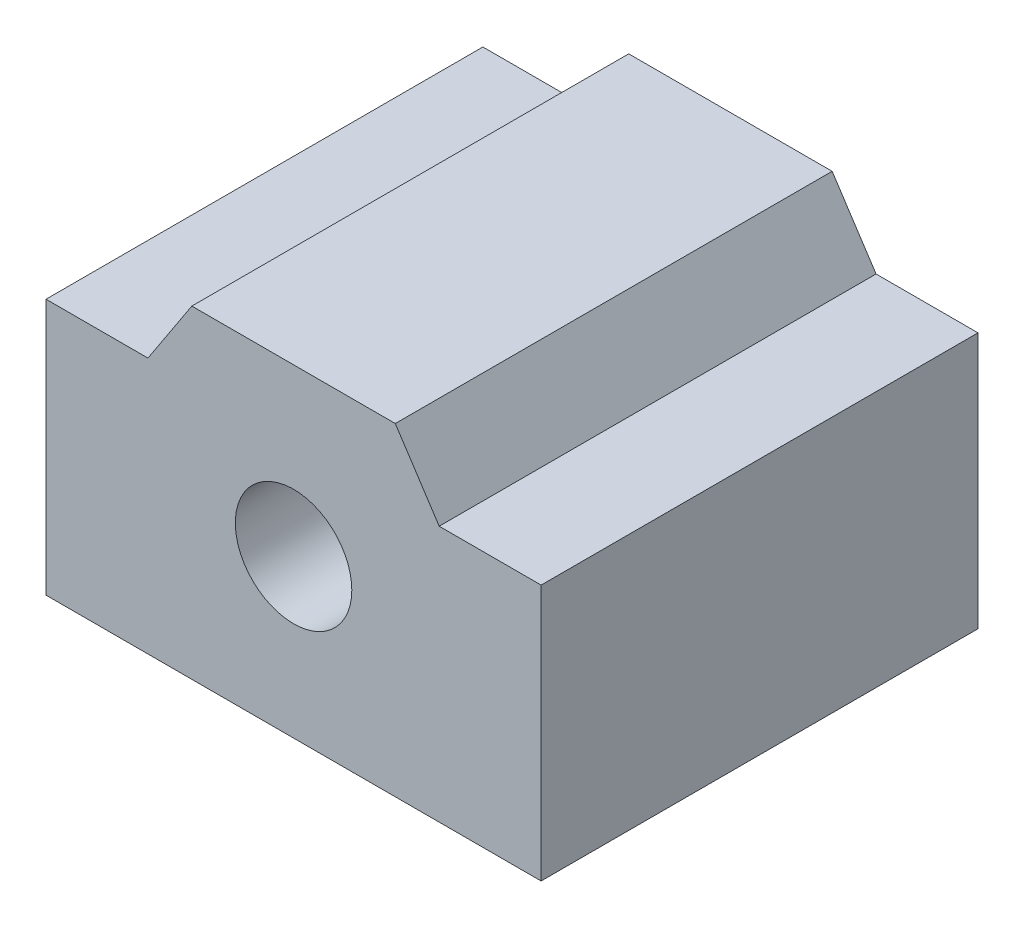
ISO-10303-21;
HEADER;
FILE_DESCRIPTION(('STEP AP214'),'2;1');
FILE_NAME('part.step','',(''),(''),'','','');
FILE_SCHEMA(('AUTOMOTIVE_DESIGN { 1 0 10303 214 1 1 1 1 }'));
ENDSEC;
DATA;
#1=APPLICATION_CONTEXT('core data for automotive mechanical design processes');
#2=APPLICATION_PROTOCOL_DEFINITION('international standard','automotive_design',2000,#1);
#3=PRODUCT_CONTEXT('',#1,'mechanical');
#4=PRODUCT('Part','Part','',(#3));
#5=PRODUCT_RELATED_PRODUCT_CATEGORY('part','',(#4));
#6=PRODUCT_DEFINITION_FORMATION('','',#4);
#7=PRODUCT_DEFINITION_CONTEXT('part definition',#1,'design');
#8=PRODUCT_DEFINITION('design','',#6,#7);
#9=PRODUCT_DEFINITION_SHAPE('','',#8);
#10=(LENGTH_UNIT() NAMED_UNIT(*) SI_UNIT(.MILLI.,.METRE.));
#11=(NAMED_UNIT(*) PLANE_ANGLE_UNIT() SI_UNIT($,.RADIAN.));
#12=(NAMED_UNIT(*) SI_UNIT($,.STERADIAN.) SOLID_ANGLE_UNIT());
#13=UNCERTAINTY_MEASURE_WITH_UNIT(LENGTH_MEASURE(1.E-05),#10,'distance_accuracy_value','');
#14=(GEOMETRIC_REPRESENTATION_CONTEXT(3) GLOBAL_UNCERTAINTY_ASSIGNED_CONTEXT((#13)) GLOBAL_UNIT_ASSIGNED_CONTEXT((#10,
#11,#12)) REPRESENTATION_CONTEXT('',''));
#15=CARTESIAN_POINT('',(0.,0.,0.));
#16=DIRECTION('',(0.,0.,1.));
#17=DIRECTION('',(1.,0.,0.));
#18=AXIS2_PLACEMENT_3D('',#15,#16,#17);
#19=CARTESIAN_POINT('',(0.,22.2,0.));
#20=DIRECTION('',(1.,0.,0.));
#21=DIRECTION('',(0.,0.,-1.));
#22=AXIS2_PLACEMENT_3D('',#19,#20,#21);
#23=PLANE('',#22);
#24=DIRECTION('',(0.,-1.,0.));
#25=VECTOR('',#24,1.);
#26=CARTESIAN_POINT('',(0.,22.2,0.));
#27=LINE('',#26,#25);
#28=CARTESIAN_POINT('',(0.,17.6,0.));
#29=VERTEX_POINT('',#28);
#30=CARTESIAN_POINT('',(0.,0.,0.));
#31=VERTEX_POINT('',#30);
#32=EDGE_CURVE('E11',#29,#31,#27,.T.);
#33=ORIENTED_EDGE('',*,*,#32,.F.);
#34=DIRECTION('',(0.,0.,1.));
#35=VECTOR('',#34,1.);
#36=CARTESIAN_POINT('',(0.,17.6,-30.));
#37=LINE('',#36,#35);
#38=CARTESIAN_POINT('',(0.,17.6,-30.));
#39=VERTEX_POINT('',#38);
#40=EDGE_CURVE('E132',#39,#29,#37,.T.);
#41=ORIENTED_EDGE('',*,*,#40,.F.);
#42=DIRECTION('',(0.,-1.,0.));
#43=VECTOR('',#42,1.);
#44=CARTESIAN_POINT('',(0.,22.2,-30.));
#45=LINE('',#44,#43);
#46=CARTESIAN_POINT('',(0.,0.,-30.));
#47=VERTEX_POINT('',#46);
#48=EDGE_CURVE('E147',#39,#47,#45,.T.);
#49=ORIENTED_EDGE('',*,*,#48,.T.);
#50=DIRECTION('',(0.,0.,1.));
#51=VECTOR('',#50,1.);
#52=CARTESIAN_POINT('',(0.,0.,0.));
#53=LINE('',#52,#51);
#54=EDGE_CURVE('E124',#47,#31,#53,.T.);
#55=ORIENTED_EDGE('',*,*,#54,.T.);
#56=EDGE_LOOP('',(#33,#41,#49,#55));
#57=FACE_BOUND('',#56,.T.);
#58=ADVANCED_FACE('F32',(#57),#23,.F.);
#59=CARTESIAN_POINT('',(0.,22.2,0.));
#60=DIRECTION('',(0.,0.,-1.));
#61=DIRECTION('',(-1.,0.,0.));
#62=AXIS2_PLACEMENT_3D('',#59,#60,#61);
#63=PLANE('',#62);
#64=CARTESIAN_POINT('',(17.,10.8,0.));
#65=DIRECTION('',(0.,0.,1.));
#66=DIRECTION('',(1.,0.,0.));
#67=AXIS2_PLACEMENT_3D('',#64,#65,#66);
#68=CIRCLE('',#67,4.);
#69=CARTESIAN_POINT('',(21.,10.8,0.));
#70=VERTEX_POINT('',#69);
#71=EDGE_CURVE('E119',#70,#70,#68,.T.);
#72=ORIENTED_EDGE('',*,*,#71,.F.);
#73=EDGE_LOOP('',(#72));
#74=FACE_BOUND('',#73,.T.);
#75=DIRECTION('',(0.,-1.,0.));
#76=VECTOR('',#75,1.);
#77=CARTESIAN_POINT('',(34.,22.2,0.));
#78=LINE('',#77,#76);
#79=CARTESIAN_POINT('',(34.,17.6,0.));
#80=VERTEX_POINT('',#79);
#81=CARTESIAN_POINT('',(34.,0.,0.));
#82=VERTEX_POINT('',#81);
#83=EDGE_CURVE('E39',#80,#82,#78,.T.);
#84=ORIENTED_EDGE('',*,*,#83,.F.);
#85=DIRECTION('',(1.,0.,0.));
#86=VECTOR('',#85,1.);
#87=CARTESIAN_POINT('',(34.,17.6,0.));
#88=LINE('',#87,#86);
#89=CARTESIAN_POINT('',(27.,17.6,0.));
#90=VERTEX_POINT('',#89);
#91=EDGE_CURVE('E115',#90,#80,#88,.T.);
#92=ORIENTED_EDGE('',*,*,#91,.F.);
#93=DIRECTION('',(0.548175033879322,-0.836363636363636,0.));
#94=VECTOR('',#93,1.);
#95=CARTESIAN_POINT('',(27.,17.6,0.));
#96=LINE('',#95,#94);
#97=CARTESIAN_POINT('',(23.9850373136637,22.2,0.));
#98=VERTEX_POINT('',#97);
#99=EDGE_CURVE('E97',#98,#90,#96,.T.);
#100=ORIENTED_EDGE('',*,*,#99,.F.);
#101=DIRECTION('',(1.,0.,0.));
#102=VECTOR('',#101,1.);
#103=CARTESIAN_POINT('',(0.,22.2,0.));
#104=LINE('',#103,#102);
#105=CARTESIAN_POINT('',(10.0149626863363,22.2,0.));
#106=VERTEX_POINT('',#105);
#107=EDGE_CURVE('E142',#106,#98,#104,.T.);
#108=ORIENTED_EDGE('',*,*,#107,.F.);
#109=DIRECTION('',(0.548175033879322,0.836363636363636,0.));
#110=VECTOR('',#109,1.);
#111=CARTESIAN_POINT('',(7.,17.6,0.));
#112=LINE('',#111,#110);
#113=CARTESIAN_POINT('',(7.,17.6,0.));
#114=VERTEX_POINT('',#113);
#115=EDGE_CURVE('E54',#114,#106,#112,.T.);
#116=ORIENTED_EDGE('',*,*,#115,.F.);
#117=DIRECTION('',(1.,0.,0.));
#118=VECTOR('',#117,1.);
#119=CARTESIAN_POINT('',(0.,17.6,0.));
#120=LINE('',#119,#118);
#121=EDGE_CURVE('E133',#29,#114,#120,.T.);
#122=ORIENTED_EDGE('',*,*,#121,.F.);
#123=ORIENTED_EDGE('',*,*,#32,.T.);
#124=DIRECTION('',(1.,0.,0.));
#125=VECTOR('',#124,1.);
#126=CARTESIAN_POINT('',(0.,0.,0.));
#127=LINE('',#126,#125);
#128=EDGE_CURVE('E150',#31,#82,#127,.T.);
#129=ORIENTED_EDGE('',*,*,#128,.T.);
#130=EDGE_LOOP('',(#84,#92,#100,#108,#116,#122,#123,#129));
#131=FACE_BOUND('',#130,.T.);
#132=ADVANCED_FACE('F167',(#74,#131),#63,.F.);
#133=CARTESIAN_POINT('',(34.,22.2,0.));
#134=DIRECTION('',(-1.,0.,0.));
#135=DIRECTION('',(0.,0.,1.));
#136=AXIS2_PLACEMENT_3D('',#133,#134,#135);
#137=PLANE('',#136);
#138=DIRECTION('',(0.,-1.,0.));
#139=VECTOR('',#138,1.);
#140=CARTESIAN_POINT('',(34.,22.2,-30.));
#141=LINE('',#140,#139);
#142=CARTESIAN_POINT('',(34.,17.6,-30.));
#143=VERTEX_POINT('',#142);
#144=CARTESIAN_POINT('',(34.,0.,-30.));
#145=VERTEX_POINT('',#144);
#146=EDGE_CURVE('E159',#143,#145,#141,.T.);
#147=ORIENTED_EDGE('',*,*,#146,.F.);
#148=DIRECTION('',(0.,0.,1.));
#149=VECTOR('',#148,1.);
#150=CARTESIAN_POINT('',(34.,17.6,-30.));
#151=LINE('',#150,#149);
#152=EDGE_CURVE('E100',#143,#80,#151,.T.);
#153=ORIENTED_EDGE('',*,*,#152,.T.);
#154=ORIENTED_EDGE('',*,*,#83,.T.);
#155=DIRECTION('',(0.,0.,-1.));
#156=VECTOR('',#155,1.);
#157=CARTESIAN_POINT('',(34.,0.,0.));
#158=LINE('',#157,#156);
#159=EDGE_CURVE('E153',#82,#145,#158,.T.);
#160=ORIENTED_EDGE('',*,*,#159,.T.);
#161=EDGE_LOOP('',(#147,#153,#154,#160));
#162=FACE_BOUND('',#161,.T.);
#163=ADVANCED_FACE('F162',(#162),#137,.F.);
#164=CARTESIAN_POINT('',(0.,22.2,-30.));
#165=DIRECTION('',(0.,0.,1.));
#166=DIRECTION('',(1.,0.,0.));
#167=AXIS2_PLACEMENT_3D('',#164,#165,#166);
#168=PLANE('',#167);
#169=CARTESIAN_POINT('',(17.,10.8,-30.));
#170=DIRECTION('',(0.,0.,1.));
#171=DIRECTION('',(1.,0.,0.));
#172=AXIS2_PLACEMENT_3D('',#169,#170,#171);
#173=CIRCLE('',#172,4.);
#174=CARTESIAN_POINT('',(21.,10.8,-30.));
#175=VERTEX_POINT('',#174);
#176=EDGE_CURVE('E136',#175,#175,#173,.T.);
#177=ORIENTED_EDGE('',*,*,#176,.T.);
#178=EDGE_LOOP('',(#177));
#179=FACE_BOUND('',#178,.T.);
#180=DIRECTION('',(0.548175033879322,-0.836363636363636,0.));
#181=VECTOR('',#180,1.);
#182=CARTESIAN_POINT('',(27.,17.6,-30.));
#183=LINE('',#182,#181);
#184=CARTESIAN_POINT('',(23.9850373136637,22.2,-30.));
#185=VERTEX_POINT('',#184);
#186=CARTESIAN_POINT('',(27.,17.6,-30.));
#187=VERTEX_POINT('',#186);
#188=EDGE_CURVE('E46',#185,#187,#183,.T.);
#189=ORIENTED_EDGE('',*,*,#188,.T.);
#190=DIRECTION('',(1.,0.,0.));
#191=VECTOR('',#190,1.);
#192=CARTESIAN_POINT('',(34.,17.6,-30.));
#193=LINE('',#192,#191);
#194=EDGE_CURVE('E104',#187,#143,#193,.T.);
#195=ORIENTED_EDGE('',*,*,#194,.T.);
#196=ORIENTED_EDGE('',*,*,#146,.T.);
#197=DIRECTION('',(-1.,0.,0.));
#198=VECTOR('',#197,1.);
#199=CARTESIAN_POINT('',(0.,0.,-30.));
#200=LINE('',#199,#198);
#201=EDGE_CURVE('E145',#145,#47,#200,.T.);
#202=ORIENTED_EDGE('',*,*,#201,.T.);
#203=ORIENTED_EDGE('',*,*,#48,.F.);
#204=DIRECTION('',(1.,0.,0.));
#205=VECTOR('',#204,1.);
#206=CARTESIAN_POINT('',(0.,17.6,-30.));
#207=LINE('',#206,#205);
#208=CARTESIAN_POINT('',(7.,17.6,-30.));
#209=VERTEX_POINT('',#208);
#210=EDGE_CURVE('E127',#39,#209,#207,.T.);
#211=ORIENTED_EDGE('',*,*,#210,.T.);
#212=DIRECTION('',(0.548175033879322,0.836363636363636,0.));
#213=VECTOR('',#212,1.);
#214=CARTESIAN_POINT('',(7.,17.6,-30.));
#215=LINE('',#214,#213);
#216=CARTESIAN_POINT('',(10.0149626863363,22.2,-30.));
#217=VERTEX_POINT('',#216);
#218=EDGE_CURVE('E130',#209,#217,#215,.T.);
#219=ORIENTED_EDGE('',*,*,#218,.T.);
#220=DIRECTION('',(-1.,0.,0.));
#221=VECTOR('',#220,1.);
#222=CARTESIAN_POINT('',(0.,22.2,-30.));
#223=LINE('',#222,#221);
#224=EDGE_CURVE('E114',#185,#217,#223,.T.);
#225=ORIENTED_EDGE('',*,*,#224,.F.);
#226=EDGE_LOOP('',(#189,#195,#196,#202,#203,#211,#219,#225));
#227=FACE_BOUND('',#226,.T.);
#228=ADVANCED_FACE('F111',(#179,#227),#168,.F.);
#229=CARTESIAN_POINT('',(0.,22.2,0.));
#230=DIRECTION('',(0.,-1.,0.));
#231=DIRECTION('',(0.,0.,-1.));
#232=AXIS2_PLACEMENT_3D('',#229,#230,#231);
#233=PLANE('',#232);
#234=ORIENTED_EDGE('',*,*,#107,.T.);
#235=DIRECTION('',(0.,0.,1.));
#236=VECTOR('',#235,1.);
#237=CARTESIAN_POINT('',(23.9850373136637,22.2,-30.));
#238=LINE('',#237,#236);
#239=EDGE_CURVE('E101',#185,#98,#238,.T.);
#240=ORIENTED_EDGE('',*,*,#239,.F.);
#241=ORIENTED_EDGE('',*,*,#224,.T.);
#242=DIRECTION('',(0.,0.,1.));
#243=VECTOR('',#242,1.);
#244=CARTESIAN_POINT('',(10.0149626863363,22.2,-30.));
#245=LINE('',#244,#243);
#246=EDGE_CURVE('E122',#217,#106,#245,.T.);
#247=ORIENTED_EDGE('',*,*,#246,.T.);
#248=EDGE_LOOP('',(#234,#240,#241,#247));
#249=FACE_BOUND('',#248,.T.);
#250=ADVANCED_FACE('F180',(#249),#233,.F.);
#251=CARTESIAN_POINT('',(0.,0.,0.));
#252=DIRECTION('',(0.,-1.,0.));
#253=DIRECTION('',(0.,0.,-1.));
#254=AXIS2_PLACEMENT_3D('',#251,#252,#253);
#255=PLANE('',#254);
#256=ORIENTED_EDGE('',*,*,#54,.F.);
#257=ORIENTED_EDGE('',*,*,#201,.F.);
#258=ORIENTED_EDGE('',*,*,#159,.F.);
#259=ORIENTED_EDGE('',*,*,#128,.F.);
#260=EDGE_LOOP('',(#256,#257,#258,#259));
#261=FACE_BOUND('',#260,.T.);
#262=ADVANCED_FACE('F172',(#261),#255,.T.);
#263=CARTESIAN_POINT('',(7.,17.6,-30.));
#264=DIRECTION('',(0.836363636363636,-0.548175033879321,0.));
#265=DIRECTION('',(0.548175033879322,0.836363636363636,0.));
#266=AXIS2_PLACEMENT_3D('',#263,#264,#265);
#267=PLANE('',#266);
#268=ORIENTED_EDGE('',*,*,#115,.T.);
#269=ORIENTED_EDGE('',*,*,#246,.F.);
#270=ORIENTED_EDGE('',*,*,#218,.F.);
#271=DIRECTION('',(0.,0.,1.));
#272=VECTOR('',#271,1.);
#273=CARTESIAN_POINT('',(7.,17.6,-30.));
#274=LINE('',#273,#272);
#275=EDGE_CURVE('E139',#209,#114,#274,.T.);
#276=ORIENTED_EDGE('',*,*,#275,.T.);
#277=EDGE_LOOP('',(#268,#269,#270,#276));
#278=FACE_BOUND('',#277,.T.);
#279=ADVANCED_FACE('F182',(#278),#267,.F.);
#280=CARTESIAN_POINT('',(0.,17.6,-30.));
#281=DIRECTION('',(0.,-1.,0.));
#282=DIRECTION('',(0.,0.,-1.));
#283=AXIS2_PLACEMENT_3D('',#280,#281,#282);
#284=PLANE('',#283);
#285=ORIENTED_EDGE('',*,*,#121,.T.);
#286=ORIENTED_EDGE('',*,*,#275,.F.);
#287=ORIENTED_EDGE('',*,*,#210,.F.);
#288=ORIENTED_EDGE('',*,*,#40,.T.);
#289=EDGE_LOOP('',(#285,#286,#287,#288));
#290=FACE_BOUND('',#289,.T.);
#291=ADVANCED_FACE('F177',(#290),#284,.F.);
#292=CARTESIAN_POINT('',(34.,17.6,-30.));
#293=DIRECTION('',(0.,-1.,0.));
#294=DIRECTION('',(0.,0.,-1.));
#295=AXIS2_PLACEMENT_3D('',#292,#293,#294);
#296=PLANE('',#295);
#297=ORIENTED_EDGE('',*,*,#91,.T.);
#298=ORIENTED_EDGE('',*,*,#152,.F.);
#299=ORIENTED_EDGE('',*,*,#194,.F.);
#300=DIRECTION('',(0.,0.,1.));
#301=VECTOR('',#300,1.);
#302=CARTESIAN_POINT('',(27.,17.6,-30.));
#303=LINE('',#302,#301);
#304=EDGE_CURVE('E93',#187,#90,#303,.T.);
#305=ORIENTED_EDGE('',*,*,#304,.T.);
#306=EDGE_LOOP('',(#297,#298,#299,#305));
#307=FACE_BOUND('',#306,.T.);
#308=ADVANCED_FACE('F105',(#307),#296,.F.);
#309=CARTESIAN_POINT('',(27.,17.6,-30.));
#310=DIRECTION('',(-0.836363636363636,-0.548175033879321,0.));
#311=DIRECTION('',(0.548175033879322,-0.836363636363636,0.));
#312=AXIS2_PLACEMENT_3D('',#309,#310,#311);
#313=PLANE('',#312);
#314=ORIENTED_EDGE('',*,*,#99,.T.);
#315=ORIENTED_EDGE('',*,*,#304,.F.);
#316=ORIENTED_EDGE('',*,*,#188,.F.);
#317=ORIENTED_EDGE('',*,*,#239,.T.);
#318=EDGE_LOOP('',(#314,#315,#316,#317));
#319=FACE_BOUND('',#318,.T.);
#320=ADVANCED_FACE('F95',(#319),#313,.F.);
#321=CARTESIAN_POINT('',(17.,10.8,-30.));
#322=DIRECTION('',(0.,0.,1.));
#323=DIRECTION('',(1.,0.,0.));
#324=AXIS2_PLACEMENT_3D('',#321,#322,#323);
#325=CYLINDRICAL_SURFACE('',#324,4.);
#326=ORIENTED_EDGE('',*,*,#176,.F.);
#327=EDGE_LOOP('',(#326));
#328=FACE_BOUND('',#327,.T.);
#329=ORIENTED_EDGE('',*,*,#71,.T.);
#330=EDGE_LOOP('',(#329));
#331=FACE_BOUND('',#330,.T.);
#332=ADVANCED_FACE('F242',(#328,#331),#325,.F.);
#333=CLOSED_SHELL('',(#58,#132,#163,#228,#250,#262,#279,#291,#308,#320,#332));
#334=MANIFOLD_SOLID_BREP('B2',#333);
#335=ADVANCED_BREP_SHAPE_REPRESENTATION('',(#18,#334),#14);
#336=SHAPE_DEFINITION_REPRESENTATION(#9,#335);
ENDSEC;
END-ISO-10303-21;
